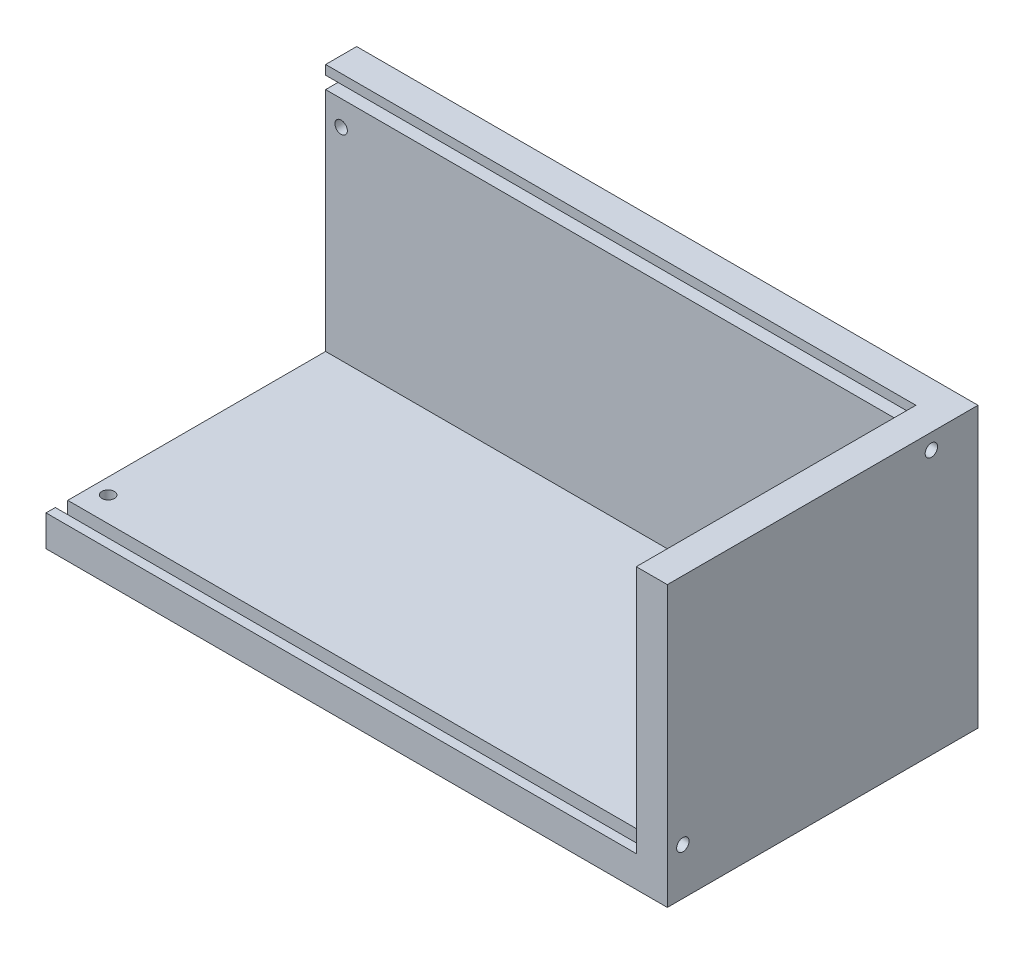
ISO-10303-21;
HEADER;
FILE_DESCRIPTION(('STEP AP214'),'2;1');
FILE_NAME('part.step','',(''),(''),'','','');
FILE_SCHEMA(('AUTOMOTIVE_DESIGN { 1 0 10303 214 1 1 1 1 }'));
ENDSEC;
DATA;
#1=APPLICATION_CONTEXT('core data for automotive mechanical design processes');
#2=APPLICATION_PROTOCOL_DEFINITION('international standard','automotive_design',2000,#1);
#3=PRODUCT_CONTEXT('',#1,'mechanical');
#4=PRODUCT('Part','Part','',(#3));
#5=PRODUCT_RELATED_PRODUCT_CATEGORY('part','',(#4));
#6=PRODUCT_DEFINITION_FORMATION('','',#4);
#7=PRODUCT_DEFINITION_CONTEXT('part definition',#1,'design');
#8=PRODUCT_DEFINITION('design','',#6,#7);
#9=PRODUCT_DEFINITION_SHAPE('','',#8);
#10=(LENGTH_UNIT() NAMED_UNIT(*) SI_UNIT(.MILLI.,.METRE.));
#11=(NAMED_UNIT(*) PLANE_ANGLE_UNIT() SI_UNIT($,.RADIAN.));
#12=(NAMED_UNIT(*) SI_UNIT($,.STERADIAN.) SOLID_ANGLE_UNIT());
#13=UNCERTAINTY_MEASURE_WITH_UNIT(LENGTH_MEASURE(1.E-05),#10,'distance_accuracy_value','');
#14=(GEOMETRIC_REPRESENTATION_CONTEXT(3) GLOBAL_UNCERTAINTY_ASSIGNED_CONTEXT((#13)) GLOBAL_UNIT_ASSIGNED_CONTEXT((#10,
#11,#12)) REPRESENTATION_CONTEXT('',''));
#15=CARTESIAN_POINT('',(0.,0.,0.));
#16=DIRECTION('',(0.,0.,1.));
#17=DIRECTION('',(1.,0.,0.));
#18=AXIS2_PLACEMENT_3D('',#15,#16,#17);
#19=CARTESIAN_POINT('',(0.,5.,0.));
#20=DIRECTION('',(0.,-1.,0.));
#21=DIRECTION('',(0.,0.,-1.));
#22=AXIS2_PLACEMENT_3D('',#19,#20,#21);
#23=PLANE('',#22);
#24=CARTESIAN_POINT('',(2.49999999999997,5.,-7.5));
#25=DIRECTION('',(0.,-1.,0.));
#26=DIRECTION('',(0.,0.,-1.));
#27=AXIS2_PLACEMENT_3D('',#24,#25,#26);
#28=CIRCLE('',#27,0.999999999999988);
#29=CARTESIAN_POINT('',(2.49999999999997,5.,-8.49999999999999));
#30=VERTEX_POINT('',#29);
#31=EDGE_CURVE('E348',#30,#30,#28,.T.);
#32=ORIENTED_EDGE('',*,*,#31,.T.);
#33=EDGE_LOOP('',(#32));
#34=FACE_BOUND('',#33,.T.);
#35=DIRECTION('',(0.,0.,1.));
#36=VECTOR('',#35,1.);
#37=CARTESIAN_POINT('',(0.,5.,0.));
#38=LINE('',#37,#36);
#39=CARTESIAN_POINT('',(0.,5.,-45.));
#40=VERTEX_POINT('',#39);
#41=CARTESIAN_POINT('',(0.,5.,-3.5));
#42=VERTEX_POINT('',#41);
#43=EDGE_CURVE('E260',#40,#42,#38,.T.);
#44=ORIENTED_EDGE('',*,*,#43,.T.);
#45=DIRECTION('',(-1.,0.,0.));
#46=VECTOR('',#45,1.);
#47=CARTESIAN_POINT('',(0.,5.,-3.5));
#48=LINE('',#47,#46);
#49=CARTESIAN_POINT('',(95.,5.,-3.5));
#50=VERTEX_POINT('',#49);
#51=EDGE_CURVE('E165',#50,#42,#48,.T.);
#52=ORIENTED_EDGE('',*,*,#51,.F.);
#53=DIRECTION('',(0.,0.,1.));
#54=VECTOR('',#53,1.);
#55=CARTESIAN_POINT('',(95.,5.,-45.));
#56=LINE('',#55,#54);
#57=CARTESIAN_POINT('',(95.,5.,-45.));
#58=VERTEX_POINT('',#57);
#59=EDGE_CURVE('E220',#58,#50,#56,.T.);
#60=ORIENTED_EDGE('',*,*,#59,.F.);
#61=DIRECTION('',(1.,0.,0.));
#62=VECTOR('',#61,1.);
#63=CARTESIAN_POINT('',(0.,5.,-45.));
#64=LINE('',#63,#62);
#65=EDGE_CURVE('E206',#40,#58,#64,.T.);
#66=ORIENTED_EDGE('',*,*,#65,.F.);
#67=EDGE_LOOP('',(#44,#52,#60,#66));
#68=FACE_BOUND('',#67,.T.);
#69=ADVANCED_FACE('F38',(#34,#68),#23,.F.);
#70=CARTESIAN_POINT('',(0.,45.,-45.));
#71=DIRECTION('',(0.,0.,-1.));
#72=DIRECTION('',(-1.,0.,0.));
#73=AXIS2_PLACEMENT_3D('',#70,#71,#72);
#74=PLANE('',#73);
#75=DIRECTION('',(0.,-1.,0.));
#76=VECTOR('',#75,1.);
#77=CARTESIAN_POINT('',(0.,45.,-45.));
#78=LINE('',#77,#76);
#79=CARTESIAN_POINT('',(0.,45.,-45.));
#80=VERTEX_POINT('',#79);
#81=CARTESIAN_POINT('',(0.,43.5,-45.));
#82=VERTEX_POINT('',#81);
#83=EDGE_CURVE('E255',#80,#82,#78,.T.);
#84=ORIENTED_EDGE('',*,*,#83,.T.);
#85=DIRECTION('',(-1.,0.,0.));
#86=VECTOR('',#85,1.);
#87=CARTESIAN_POINT('',(0.,43.5,-45.));
#88=LINE('',#87,#86);
#89=CARTESIAN_POINT('',(95.,43.5,-45.));
#90=VERTEX_POINT('',#89);
#91=EDGE_CURVE('E184',#90,#82,#88,.T.);
#92=ORIENTED_EDGE('',*,*,#91,.F.);
#93=DIRECTION('',(0.,-1.,0.));
#94=VECTOR('',#93,1.);
#95=CARTESIAN_POINT('',(95.,45.,-45.));
#96=LINE('',#95,#94);
#97=CARTESIAN_POINT('',(95.,45.,-45.));
#98=VERTEX_POINT('',#97);
#99=EDGE_CURVE('E250',#98,#90,#96,.T.);
#100=ORIENTED_EDGE('',*,*,#99,.F.);
#101=DIRECTION('',(1.,0.,0.));
#102=VECTOR('',#101,1.);
#103=CARTESIAN_POINT('',(0.,45.,-45.));
#104=LINE('',#103,#102);
#105=EDGE_CURVE('E219',#80,#98,#104,.T.);
#106=ORIENTED_EDGE('',*,*,#105,.F.);
#107=EDGE_LOOP('',(#84,#92,#100,#106));
#108=FACE_BOUND('',#107,.T.);
#109=ADVANCED_FACE('F380',(#108),#74,.F.);
#110=CARTESIAN_POINT('',(95.,5.,-1.50000000000002));
#111=VERTEX_POINT('',#110);
#112=CARTESIAN_POINT('',(95.,5.,0.));
#113=VERTEX_POINT('',#112);
#114=EDGE_CURVE('E242',#111,#113,#56,.T.);
#115=ORIENTED_EDGE('',*,*,#114,.F.);
#116=DIRECTION('',(1.,0.,0.));
#117=VECTOR('',#116,1.);
#118=CARTESIAN_POINT('',(0.,5.,-1.5));
#119=LINE('',#118,#117);
#120=CARTESIAN_POINT('',(0.,5.,-1.5));
#121=VERTEX_POINT('',#120);
#122=EDGE_CURVE('E54',#121,#111,#119,.T.);
#123=ORIENTED_EDGE('',*,*,#122,.F.);
#124=CARTESIAN_POINT('',(0.,5.,0.));
#125=VERTEX_POINT('',#124);
#126=EDGE_CURVE('E169',#121,#125,#38,.T.);
#127=ORIENTED_EDGE('',*,*,#126,.T.);
#128=DIRECTION('',(1.,0.,0.));
#129=VECTOR('',#128,1.);
#130=CARTESIAN_POINT('',(0.,5.,0.));
#131=LINE('',#130,#129);
#132=EDGE_CURVE('E264',#125,#113,#131,.T.);
#133=ORIENTED_EDGE('',*,*,#132,.T.);
#134=EDGE_LOOP('',(#115,#123,#127,#133));
#135=FACE_BOUND('',#134,.T.);
#136=ADVANCED_FACE('F316',(#135),#23,.F.);
#137=CARTESIAN_POINT('',(0.,5.,0.));
#138=DIRECTION('',(1.,0.,0.));
#139=DIRECTION('',(0.,0.,-1.));
#140=AXIS2_PLACEMENT_3D('',#137,#138,#139);
#141=PLANE('',#140);
#142=DIRECTION('',(0.,0.,1.));
#143=VECTOR('',#142,1.);
#144=CARTESIAN_POINT('',(0.,3.,-3.5));
#145=LINE('',#144,#143);
#146=CARTESIAN_POINT('',(0.,3.,-3.5));
#147=VERTEX_POINT('',#146);
#148=CARTESIAN_POINT('',(0.,3.,-1.5));
#149=VERTEX_POINT('',#148);
#150=EDGE_CURVE('E155',#147,#149,#145,.T.);
#151=ORIENTED_EDGE('',*,*,#150,.F.);
#152=DIRECTION('',(0.,1.,0.));
#153=VECTOR('',#152,1.);
#154=CARTESIAN_POINT('',(0.,3.,-3.5));
#155=LINE('',#154,#153);
#156=EDGE_CURVE('E199',#147,#42,#155,.T.);
#157=ORIENTED_EDGE('',*,*,#156,.T.);
#158=ORIENTED_EDGE('',*,*,#43,.F.);
#159=CARTESIAN_POINT('',(0.,41.5,-45.));
#160=VERTEX_POINT('',#159);
#161=EDGE_CURVE('E254',#160,#40,#78,.T.);
#162=ORIENTED_EDGE('',*,*,#161,.F.);
#163=DIRECTION('',(0.,0.,1.));
#164=VECTOR('',#163,1.);
#165=CARTESIAN_POINT('',(0.,41.5,-47.));
#166=LINE('',#165,#164);
#167=CARTESIAN_POINT('',(0.,41.5,-47.));
#168=VERTEX_POINT('',#167);
#169=EDGE_CURVE('E196',#168,#160,#166,.T.);
#170=ORIENTED_EDGE('',*,*,#169,.F.);
#171=DIRECTION('',(0.,-1.,0.));
#172=VECTOR('',#171,1.);
#173=CARTESIAN_POINT('',(0.,43.5,-47.));
#174=LINE('',#173,#172);
#175=CARTESIAN_POINT('',(0.,43.5,-47.));
#176=VERTEX_POINT('',#175);
#177=EDGE_CURVE('E179',#176,#168,#174,.T.);
#178=ORIENTED_EDGE('',*,*,#177,.F.);
#179=DIRECTION('',(0.,0.,1.));
#180=VECTOR('',#179,1.);
#181=CARTESIAN_POINT('',(0.,43.5,-47.));
#182=LINE('',#181,#180);
#183=EDGE_CURVE('E202',#176,#82,#182,.T.);
#184=ORIENTED_EDGE('',*,*,#183,.T.);
#185=ORIENTED_EDGE('',*,*,#83,.F.);
#186=DIRECTION('',(0.,0.,1.));
#187=VECTOR('',#186,1.);
#188=CARTESIAN_POINT('',(0.,45.,-50.));
#189=LINE('',#188,#187);
#190=CARTESIAN_POINT('',(0.,45.,-50.));
#191=VERTEX_POINT('',#190);
#192=EDGE_CURVE('E215',#191,#80,#189,.T.);
#193=ORIENTED_EDGE('',*,*,#192,.F.);
#194=DIRECTION('',(0.,-1.,0.));
#195=VECTOR('',#194,1.);
#196=CARTESIAN_POINT('',(0.,5.,-50.));
#197=LINE('',#196,#195);
#198=CARTESIAN_POINT('',(0.,0.,-50.));
#199=VERTEX_POINT('',#198);
#200=EDGE_CURVE('E268',#191,#199,#197,.T.);
#201=ORIENTED_EDGE('',*,*,#200,.T.);
#202=DIRECTION('',(0.,0.,1.));
#203=VECTOR('',#202,1.);
#204=CARTESIAN_POINT('',(0.,0.,0.));
#205=LINE('',#204,#203);
#206=CARTESIAN_POINT('',(0.,0.,0.));
#207=VERTEX_POINT('',#206);
#208=EDGE_CURVE('E259',#199,#207,#205,.T.);
#209=ORIENTED_EDGE('',*,*,#208,.T.);
#210=DIRECTION('',(0.,-1.,0.));
#211=VECTOR('',#210,1.);
#212=CARTESIAN_POINT('',(0.,5.,0.));
#213=LINE('',#212,#211);
#214=EDGE_CURVE('E11',#125,#207,#213,.T.);
#215=ORIENTED_EDGE('',*,*,#214,.F.);
#216=ORIENTED_EDGE('',*,*,#126,.F.);
#217=DIRECTION('',(0.,1.,0.));
#218=VECTOR('',#217,1.);
#219=CARTESIAN_POINT('',(0.,3.,-1.5));
#220=LINE('',#219,#218);
#221=EDGE_CURVE('E148',#149,#121,#220,.T.);
#222=ORIENTED_EDGE('',*,*,#221,.F.);
#223=EDGE_LOOP('',(#151,#157,#158,#162,#170,#178,#184,#185,#193,#201,#209,#215,#216,#222));
#224=FACE_BOUND('',#223,.T.);
#225=ADVANCED_FACE('F40',(#224),#141,.F.);
#226=CARTESIAN_POINT('',(0.,5.,0.));
#227=DIRECTION('',(0.,0.,-1.));
#228=DIRECTION('',(-1.,0.,0.));
#229=AXIS2_PLACEMENT_3D('',#226,#227,#228);
#230=PLANE('',#229);
#231=DIRECTION('',(1.,0.,0.));
#232=VECTOR('',#231,1.);
#233=CARTESIAN_POINT('',(0.,0.,0.));
#234=LINE('',#233,#232);
#235=CARTESIAN_POINT('',(100.,0.,0.));
#236=VERTEX_POINT('',#235);
#237=EDGE_CURVE('E272',#207,#236,#234,.T.);
#238=ORIENTED_EDGE('',*,*,#237,.T.);
#239=DIRECTION('',(0.,-1.,0.));
#240=VECTOR('',#239,1.);
#241=CARTESIAN_POINT('',(100.,5.,0.));
#242=LINE('',#241,#240);
#243=CARTESIAN_POINT('',(100.,45.,0.));
#244=VERTEX_POINT('',#243);
#245=EDGE_CURVE('E47',#244,#236,#242,.T.);
#246=ORIENTED_EDGE('',*,*,#245,.F.);
#247=DIRECTION('',(1.,0.,0.));
#248=VECTOR('',#247,1.);
#249=CARTESIAN_POINT('',(95.,45.,0.));
#250=LINE('',#249,#248);
#251=CARTESIAN_POINT('',(95.,45.,0.));
#252=VERTEX_POINT('',#251);
#253=EDGE_CURVE('E226',#252,#244,#250,.T.);
#254=ORIENTED_EDGE('',*,*,#253,.F.);
#255=DIRECTION('',(0.,-1.,0.));
#256=VECTOR('',#255,1.);
#257=CARTESIAN_POINT('',(95.,45.,0.));
#258=LINE('',#257,#256);
#259=EDGE_CURVE('E238',#252,#113,#258,.T.);
#260=ORIENTED_EDGE('',*,*,#259,.T.);
#261=ORIENTED_EDGE('',*,*,#132,.F.);
#262=ORIENTED_EDGE('',*,*,#214,.T.);
#263=EDGE_LOOP('',(#238,#246,#254,#260,#261,#262));
#264=FACE_BOUND('',#263,.T.);
#265=ADVANCED_FACE('F309',(#264),#230,.F.);
#266=CARTESIAN_POINT('',(100.,5.,0.));
#267=DIRECTION('',(-1.,0.,0.));
#268=DIRECTION('',(0.,0.,1.));
#269=AXIS2_PLACEMENT_3D('',#266,#267,#268);
#270=PLANE('',#269);
#271=CARTESIAN_POINT('',(100.,42.5,-42.5));
#272=DIRECTION('',(-1.,0.,0.));
#273=DIRECTION('',(0.,0.,1.));
#274=AXIS2_PLACEMENT_3D('',#271,#272,#273);
#275=CIRCLE('',#274,0.999999999999994);
#276=CARTESIAN_POINT('',(100.,42.5,-41.5));
#277=VERTEX_POINT('',#276);
#278=EDGE_CURVE('E340',#277,#277,#275,.T.);
#279=ORIENTED_EDGE('',*,*,#278,.T.);
#280=EDGE_LOOP('',(#279));
#281=FACE_BOUND('',#280,.T.);
#282=CARTESIAN_POINT('',(100.,7.5,-2.5));
#283=DIRECTION('',(-1.,0.,0.));
#284=DIRECTION('',(0.,0.,1.));
#285=AXIS2_PLACEMENT_3D('',#282,#283,#284);
#286=CIRCLE('',#285,0.999999999999994);
#287=CARTESIAN_POINT('',(100.,7.5,-1.50000000000001));
#288=VERTEX_POINT('',#287);
#289=EDGE_CURVE('E329',#288,#288,#286,.T.);
#290=ORIENTED_EDGE('',*,*,#289,.T.);
#291=EDGE_LOOP('',(#290));
#292=FACE_BOUND('',#291,.T.);
#293=DIRECTION('',(0.,0.,-1.));
#294=VECTOR('',#293,1.);
#295=CARTESIAN_POINT('',(100.,0.,0.));
#296=LINE('',#295,#294);
#297=CARTESIAN_POINT('',(100.,0.,-50.));
#298=VERTEX_POINT('',#297);
#299=EDGE_CURVE('E275',#236,#298,#296,.T.);
#300=ORIENTED_EDGE('',*,*,#299,.T.);
#301=DIRECTION('',(0.,-1.,0.));
#302=VECTOR('',#301,1.);
#303=CARTESIAN_POINT('',(100.,5.,-50.));
#304=LINE('',#303,#302);
#305=CARTESIAN_POINT('',(100.,45.,-50.));
#306=VERTEX_POINT('',#305);
#307=EDGE_CURVE('E284',#306,#298,#304,.T.);
#308=ORIENTED_EDGE('',*,*,#307,.F.);
#309=DIRECTION('',(0.,0.,-1.));
#310=VECTOR('',#309,1.);
#311=CARTESIAN_POINT('',(100.,45.,0.));
#312=LINE('',#311,#310);
#313=EDGE_CURVE('E230',#244,#306,#312,.T.);
#314=ORIENTED_EDGE('',*,*,#313,.F.);
#315=ORIENTED_EDGE('',*,*,#245,.T.);
#316=EDGE_LOOP('',(#300,#308,#314,#315));
#317=FACE_BOUND('',#316,.T.);
#318=ADVANCED_FACE('F292',(#281,#292,#317),#270,.F.);
#319=CARTESIAN_POINT('',(0.,5.,-50.));
#320=DIRECTION('',(0.,0.,1.));
#321=DIRECTION('',(1.,0.,0.));
#322=AXIS2_PLACEMENT_3D('',#319,#320,#321);
#323=PLANE('',#322);
#324=CARTESIAN_POINT('',(2.49999999999997,37.5,-50.));
#325=DIRECTION('',(0.,0.,-1.));
#326=DIRECTION('',(-1.,0.,0.));
#327=AXIS2_PLACEMENT_3D('',#324,#325,#326);
#328=CIRCLE('',#327,0.999999999999989);
#329=CARTESIAN_POINT('',(1.49999999999999,37.5,-50.));
#330=VERTEX_POINT('',#329);
#331=EDGE_CURVE('E360',#330,#330,#328,.T.);
#332=ORIENTED_EDGE('',*,*,#331,.F.);
#333=EDGE_LOOP('',(#332));
#334=FACE_BOUND('',#333,.T.);
#335=DIRECTION('',(-1.,0.,0.));
#336=VECTOR('',#335,1.);
#337=CARTESIAN_POINT('',(0.,0.,-50.));
#338=LINE('',#337,#336);
#339=EDGE_CURVE('E278',#298,#199,#338,.T.);
#340=ORIENTED_EDGE('',*,*,#339,.T.);
#341=ORIENTED_EDGE('',*,*,#200,.F.);
#342=DIRECTION('',(-1.,0.,0.));
#343=VECTOR('',#342,1.);
#344=CARTESIAN_POINT('',(100.,45.,-50.));
#345=LINE('',#344,#343);
#346=EDGE_CURVE('E234',#306,#191,#345,.T.);
#347=ORIENTED_EDGE('',*,*,#346,.F.);
#348=ORIENTED_EDGE('',*,*,#307,.T.);
#349=EDGE_LOOP('',(#340,#341,#347,#348));
#350=FACE_BOUND('',#349,.T.);
#351=ADVANCED_FACE('F300',(#334,#350),#323,.F.);
#352=CARTESIAN_POINT('',(0.,0.,0.));
#353=DIRECTION('',(0.,-1.,0.));
#354=DIRECTION('',(0.,0.,-1.));
#355=AXIS2_PLACEMENT_3D('',#352,#353,#354);
#356=PLANE('',#355);
#357=CARTESIAN_POINT('',(2.49999999999997,0.,-7.5));
#358=DIRECTION('',(0.,-1.,0.));
#359=DIRECTION('',(0.,0.,-1.));
#360=AXIS2_PLACEMENT_3D('',#357,#358,#359);
#361=CIRCLE('',#360,0.999999999999989);
#362=CARTESIAN_POINT('',(2.49999999999997,0.,-8.49999999999999));
#363=VERTEX_POINT('',#362);
#364=EDGE_CURVE('E352',#363,#363,#361,.T.);
#365=ORIENTED_EDGE('',*,*,#364,.F.);
#366=EDGE_LOOP('',(#365));
#367=FACE_BOUND('',#366,.T.);
#368=ORIENTED_EDGE('',*,*,#208,.F.);
#369=ORIENTED_EDGE('',*,*,#339,.F.);
#370=ORIENTED_EDGE('',*,*,#299,.F.);
#371=ORIENTED_EDGE('',*,*,#237,.F.);
#372=EDGE_LOOP('',(#368,#369,#370,#371));
#373=FACE_BOUND('',#372,.T.);
#374=ADVANCED_FACE('F298',(#367,#373),#356,.T.);
#375=CARTESIAN_POINT('',(2.49999999999997,37.5,-45.));
#376=DIRECTION('',(0.,0.,-1.));
#377=DIRECTION('',(-1.,0.,0.));
#378=AXIS2_PLACEMENT_3D('',#375,#376,#377);
#379=CIRCLE('',#378,0.999999999999988);
#380=CARTESIAN_POINT('',(1.49999999999999,37.5,-45.));
#381=VERTEX_POINT('',#380);
#382=EDGE_CURVE('E356',#381,#381,#379,.T.);
#383=ORIENTED_EDGE('',*,*,#382,.T.);
#384=EDGE_LOOP('',(#383));
#385=FACE_BOUND('',#384,.T.);
#386=CARTESIAN_POINT('',(95.,41.5,-45.));
#387=VERTEX_POINT('',#386);
#388=EDGE_CURVE('E249',#387,#58,#96,.T.);
#389=ORIENTED_EDGE('',*,*,#388,.F.);
#390=DIRECTION('',(1.,0.,0.));
#391=VECTOR('',#390,1.);
#392=CARTESIAN_POINT('',(0.,41.5,-45.));
#393=LINE('',#392,#391);
#394=EDGE_CURVE('E62',#160,#387,#393,.T.);
#395=ORIENTED_EDGE('',*,*,#394,.F.);
#396=ORIENTED_EDGE('',*,*,#161,.T.);
#397=ORIENTED_EDGE('',*,*,#65,.T.);
#398=EDGE_LOOP('',(#389,#395,#396,#397));
#399=FACE_BOUND('',#398,.T.);
#400=ADVANCED_FACE('F374',(#385,#399),#74,.F.);
#401=CARTESIAN_POINT('',(95.,45.,-45.));
#402=DIRECTION('',(1.,0.,0.));
#403=DIRECTION('',(0.,0.,-1.));
#404=AXIS2_PLACEMENT_3D('',#401,#402,#403);
#405=PLANE('',#404);
#406=CARTESIAN_POINT('',(95.,42.5,-42.5));
#407=DIRECTION('',(-1.,0.,0.));
#408=DIRECTION('',(0.,0.,1.));
#409=AXIS2_PLACEMENT_3D('',#406,#407,#408);
#410=CIRCLE('',#409,0.999999999999994);
#411=CARTESIAN_POINT('',(95.,42.5,-41.5));
#412=VERTEX_POINT('',#411);
#413=EDGE_CURVE('E344',#412,#412,#410,.T.);
#414=ORIENTED_EDGE('',*,*,#413,.F.);
#415=EDGE_LOOP('',(#414));
#416=FACE_BOUND('',#415,.T.);
#417=CARTESIAN_POINT('',(95.,7.5,-2.5));
#418=DIRECTION('',(-1.,0.,0.));
#419=DIRECTION('',(0.,0.,1.));
#420=AXIS2_PLACEMENT_3D('',#417,#418,#419);
#421=CIRCLE('',#420,0.999999999999994);
#422=CARTESIAN_POINT('',(95.,7.5,-1.50000000000001));
#423=VERTEX_POINT('',#422);
#424=EDGE_CURVE('E336',#423,#423,#421,.T.);
#425=ORIENTED_EDGE('',*,*,#424,.F.);
#426=EDGE_LOOP('',(#425));
#427=FACE_BOUND('',#426,.T.);
#428=ORIENTED_EDGE('',*,*,#59,.T.);
#429=DIRECTION('',(0.,1.,0.));
#430=VECTOR('',#429,1.);
#431=CARTESIAN_POINT('',(95.,3.,-3.5));
#432=LINE('',#431,#430);
#433=CARTESIAN_POINT('',(95.,3.,-3.5));
#434=VERTEX_POINT('',#433);
#435=EDGE_CURVE('E174',#434,#50,#432,.T.);
#436=ORIENTED_EDGE('',*,*,#435,.F.);
#437=DIRECTION('',(0.,0.,-1.));
#438=VECTOR('',#437,1.);
#439=CARTESIAN_POINT('',(95.,3.,-3.5));
#440=LINE('',#439,#438);
#441=CARTESIAN_POINT('',(95.,3.,-1.5));
#442=VERTEX_POINT('',#441);
#443=EDGE_CURVE('E154',#442,#434,#440,.T.);
#444=ORIENTED_EDGE('',*,*,#443,.F.);
#445=DIRECTION('',(0.,1.,0.));
#446=VECTOR('',#445,1.);
#447=CARTESIAN_POINT('',(95.,3.,-1.5));
#448=LINE('',#447,#446);
#449=EDGE_CURVE('E149',#442,#111,#448,.T.);
#450=ORIENTED_EDGE('',*,*,#449,.T.);
#451=ORIENTED_EDGE('',*,*,#114,.T.);
#452=ORIENTED_EDGE('',*,*,#259,.F.);
#453=DIRECTION('',(0.,0.,1.));
#454=VECTOR('',#453,1.);
#455=CARTESIAN_POINT('',(95.,45.,-45.));
#456=LINE('',#455,#454);
#457=EDGE_CURVE('E223',#98,#252,#456,.T.);
#458=ORIENTED_EDGE('',*,*,#457,.F.);
#459=ORIENTED_EDGE('',*,*,#99,.T.);
#460=DIRECTION('',(0.,0.,1.));
#461=VECTOR('',#460,1.);
#462=CARTESIAN_POINT('',(95.,43.5,-47.));
#463=LINE('',#462,#461);
#464=CARTESIAN_POINT('',(95.,43.5,-47.));
#465=VERTEX_POINT('',#464);
#466=EDGE_CURVE('E207',#465,#90,#463,.T.);
#467=ORIENTED_EDGE('',*,*,#466,.F.);
#468=DIRECTION('',(0.,1.,0.));
#469=VECTOR('',#468,1.);
#470=CARTESIAN_POINT('',(95.,43.5,-47.));
#471=LINE('',#470,#469);
#472=CARTESIAN_POINT('',(95.,41.5,-47.));
#473=VERTEX_POINT('',#472);
#474=EDGE_CURVE('E188',#473,#465,#471,.T.);
#475=ORIENTED_EDGE('',*,*,#474,.F.);
#476=DIRECTION('',(0.,0.,1.));
#477=VECTOR('',#476,1.);
#478=CARTESIAN_POINT('',(95.,41.5,-47.));
#479=LINE('',#478,#477);
#480=EDGE_CURVE('E210',#473,#387,#479,.T.);
#481=ORIENTED_EDGE('',*,*,#480,.T.);
#482=ORIENTED_EDGE('',*,*,#388,.T.);
#483=EDGE_LOOP('',(#428,#436,#444,#450,#451,#452,#458,#459,#467,#475,#481,#482));
#484=FACE_BOUND('',#483,.T.);
#485=ADVANCED_FACE('F312',(#416,#427,#484),#405,.F.);
#486=CARTESIAN_POINT('',(0.,45.,0.));
#487=DIRECTION('',(0.,1.,0.));
#488=DIRECTION('',(0.,0.,1.));
#489=AXIS2_PLACEMENT_3D('',#486,#487,#488);
#490=PLANE('',#489);
#491=ORIENTED_EDGE('',*,*,#192,.T.);
#492=ORIENTED_EDGE('',*,*,#105,.T.);
#493=ORIENTED_EDGE('',*,*,#457,.T.);
#494=ORIENTED_EDGE('',*,*,#253,.T.);
#495=ORIENTED_EDGE('',*,*,#313,.T.);
#496=ORIENTED_EDGE('',*,*,#346,.T.);
#497=EDGE_LOOP('',(#491,#492,#493,#494,#495,#496));
#498=FACE_BOUND('',#497,.T.);
#499=ADVANCED_FACE('F305',(#498),#490,.T.);
#500=CARTESIAN_POINT('',(0.,43.5,-47.));
#501=DIRECTION('',(0.,1.,0.));
#502=DIRECTION('',(0.,0.,1.));
#503=AXIS2_PLACEMENT_3D('',#500,#501,#502);
#504=PLANE('',#503);
#505=ORIENTED_EDGE('',*,*,#91,.T.);
#506=ORIENTED_EDGE('',*,*,#183,.F.);
#507=DIRECTION('',(-1.,0.,0.));
#508=VECTOR('',#507,1.);
#509=CARTESIAN_POINT('',(0.,43.5,-47.));
#510=LINE('',#509,#508);
#511=EDGE_CURVE('E192',#465,#176,#510,.T.);
#512=ORIENTED_EDGE('',*,*,#511,.F.);
#513=ORIENTED_EDGE('',*,*,#466,.T.);
#514=EDGE_LOOP('',(#505,#506,#512,#513));
#515=FACE_BOUND('',#514,.T.);
#516=ADVANCED_FACE('F440',(#515),#504,.F.);
#517=CARTESIAN_POINT('',(0.,41.5,-47.));
#518=DIRECTION('',(0.,-1.,0.));
#519=DIRECTION('',(0.,0.,-1.));
#520=AXIS2_PLACEMENT_3D('',#517,#518,#519);
#521=PLANE('',#520);
#522=ORIENTED_EDGE('',*,*,#394,.T.);
#523=ORIENTED_EDGE('',*,*,#480,.F.);
#524=DIRECTION('',(1.,0.,0.));
#525=VECTOR('',#524,1.);
#526=CARTESIAN_POINT('',(0.,41.5,-47.));
#527=LINE('',#526,#525);
#528=EDGE_CURVE('E183',#168,#473,#527,.T.);
#529=ORIENTED_EDGE('',*,*,#528,.F.);
#530=ORIENTED_EDGE('',*,*,#169,.T.);
#531=EDGE_LOOP('',(#522,#523,#529,#530));
#532=FACE_BOUND('',#531,.T.);
#533=ADVANCED_FACE('F465',(#532),#521,.F.);
#534=CARTESIAN_POINT('',(0.,0.,-47.));
#535=DIRECTION('',(0.,0.,1.));
#536=DIRECTION('',(1.,0.,0.));
#537=AXIS2_PLACEMENT_3D('',#534,#535,#536);
#538=PLANE('',#537);
#539=ORIENTED_EDGE('',*,*,#177,.T.);
#540=ORIENTED_EDGE('',*,*,#528,.T.);
#541=ORIENTED_EDGE('',*,*,#474,.T.);
#542=ORIENTED_EDGE('',*,*,#511,.T.);
#543=EDGE_LOOP('',(#539,#540,#541,#542));
#544=FACE_BOUND('',#543,.T.);
#545=ADVANCED_FACE('F473',(#544),#538,.T.);
#546=CARTESIAN_POINT('',(0.,3.,-3.5));
#547=DIRECTION('',(0.,0.,-1.));
#548=DIRECTION('',(-1.,0.,0.));
#549=AXIS2_PLACEMENT_3D('',#546,#547,#548);
#550=PLANE('',#549);
#551=ORIENTED_EDGE('',*,*,#51,.T.);
#552=ORIENTED_EDGE('',*,*,#156,.F.);
#553=DIRECTION('',(-1.,0.,0.));
#554=VECTOR('',#553,1.);
#555=CARTESIAN_POINT('',(0.,3.,-3.5));
#556=LINE('',#555,#554);
#557=EDGE_CURVE('E161',#434,#147,#556,.T.);
#558=ORIENTED_EDGE('',*,*,#557,.F.);
#559=ORIENTED_EDGE('',*,*,#435,.T.);
#560=EDGE_LOOP('',(#551,#552,#558,#559));
#561=FACE_BOUND('',#560,.T.);
#562=ADVANCED_FACE('F479',(#561),#550,.F.);
#563=CARTESIAN_POINT('',(0.,3.,-1.5));
#564=DIRECTION('',(0.,0.,1.));
#565=DIRECTION('',(1.,0.,0.));
#566=AXIS2_PLACEMENT_3D('',#563,#564,#565);
#567=PLANE('',#566);
#568=ORIENTED_EDGE('',*,*,#122,.T.);
#569=ORIENTED_EDGE('',*,*,#449,.F.);
#570=DIRECTION('',(1.,0.,0.));
#571=VECTOR('',#570,1.);
#572=CARTESIAN_POINT('',(0.,3.,-1.5));
#573=LINE('',#572,#571);
#574=EDGE_CURVE('E144',#149,#442,#573,.T.);
#575=ORIENTED_EDGE('',*,*,#574,.F.);
#576=ORIENTED_EDGE('',*,*,#221,.T.);
#577=EDGE_LOOP('',(#568,#569,#575,#576));
#578=FACE_BOUND('',#577,.T.);
#579=ADVANCED_FACE('F146',(#578),#567,.F.);
#580=CARTESIAN_POINT('',(0.,3.,0.));
#581=DIRECTION('',(0.,1.,0.));
#582=DIRECTION('',(0.,0.,1.));
#583=AXIS2_PLACEMENT_3D('',#580,#581,#582);
#584=PLANE('',#583);
#585=ORIENTED_EDGE('',*,*,#150,.T.);
#586=ORIENTED_EDGE('',*,*,#574,.T.);
#587=ORIENTED_EDGE('',*,*,#443,.T.);
#588=ORIENTED_EDGE('',*,*,#557,.T.);
#589=EDGE_LOOP('',(#585,#586,#587,#588));
#590=FACE_BOUND('',#589,.T.);
#591=ADVANCED_FACE('F159',(#590),#584,.T.);
#592=CARTESIAN_POINT('',(95.,7.5,-2.5));
#593=DIRECTION('',(-1.,0.,0.));
#594=DIRECTION('',(0.,0.,1.));
#595=AXIS2_PLACEMENT_3D('',#592,#593,#594);
#596=CYLINDRICAL_SURFACE('',#595,0.999999999999994);
#597=ORIENTED_EDGE('',*,*,#289,.F.);
#598=EDGE_LOOP('',(#597));
#599=FACE_BOUND('',#598,.T.);
#600=ORIENTED_EDGE('',*,*,#424,.T.);
#601=EDGE_LOOP('',(#600));
#602=FACE_BOUND('',#601,.T.);
#603=ADVANCED_FACE('F496',(#599,#602),#596,.F.);
#604=CARTESIAN_POINT('',(95.,42.5,-42.5));
#605=DIRECTION('',(-1.,0.,0.));
#606=DIRECTION('',(0.,0.,1.));
#607=AXIS2_PLACEMENT_3D('',#604,#605,#606);
#608=CYLINDRICAL_SURFACE('',#607,0.999999999999994);
#609=ORIENTED_EDGE('',*,*,#278,.F.);
#610=EDGE_LOOP('',(#609));
#611=FACE_BOUND('',#610,.T.);
#612=ORIENTED_EDGE('',*,*,#413,.T.);
#613=EDGE_LOOP('',(#612));
#614=FACE_BOUND('',#613,.T.);
#615=ADVANCED_FACE('F502',(#611,#614),#608,.F.);
#616=CARTESIAN_POINT('',(2.49999999999997,0.,-7.5));
#617=DIRECTION('',(0.,-1.,0.));
#618=DIRECTION('',(0.,0.,-1.));
#619=AXIS2_PLACEMENT_3D('',#616,#617,#618);
#620=CYLINDRICAL_SURFACE('',#619,0.999999999999988);
#621=ORIENTED_EDGE('',*,*,#364,.T.);
#622=EDGE_LOOP('',(#621));
#623=FACE_BOUND('',#622,.T.);
#624=ORIENTED_EDGE('',*,*,#31,.F.);
#625=EDGE_LOOP('',(#624));
#626=FACE_BOUND('',#625,.T.);
#627=ADVANCED_FACE('F509',(#623,#626),#620,.F.);
#628=CARTESIAN_POINT('',(2.49999999999997,37.5,-50.));
#629=DIRECTION('',(0.,0.,-1.));
#630=DIRECTION('',(-1.,0.,0.));
#631=AXIS2_PLACEMENT_3D('',#628,#629,#630);
#632=CYLINDRICAL_SURFACE('',#631,0.999999999999988);
#633=ORIENTED_EDGE('',*,*,#331,.T.);
#634=EDGE_LOOP('',(#633));
#635=FACE_BOUND('',#634,.T.);
#636=ORIENTED_EDGE('',*,*,#382,.F.);
#637=EDGE_LOOP('',(#636));
#638=FACE_BOUND('',#637,.T.);
#639=ADVANCED_FACE('F365',(#635,#638),#632,.F.);
#640=CLOSED_SHELL('',(#69,#109,#136,#225,#265,#318,#351,#374,#400,#485,#499,#516,#533,#545,#562,
#579,#591,#603,#615,#627,#639));
#641=MANIFOLD_SOLID_BREP('B2',#640);
#642=ADVANCED_BREP_SHAPE_REPRESENTATION('',(#18,#641),#14);
#643=SHAPE_DEFINITION_REPRESENTATION(#9,#642);
ENDSEC;
END-ISO-10303-21;
